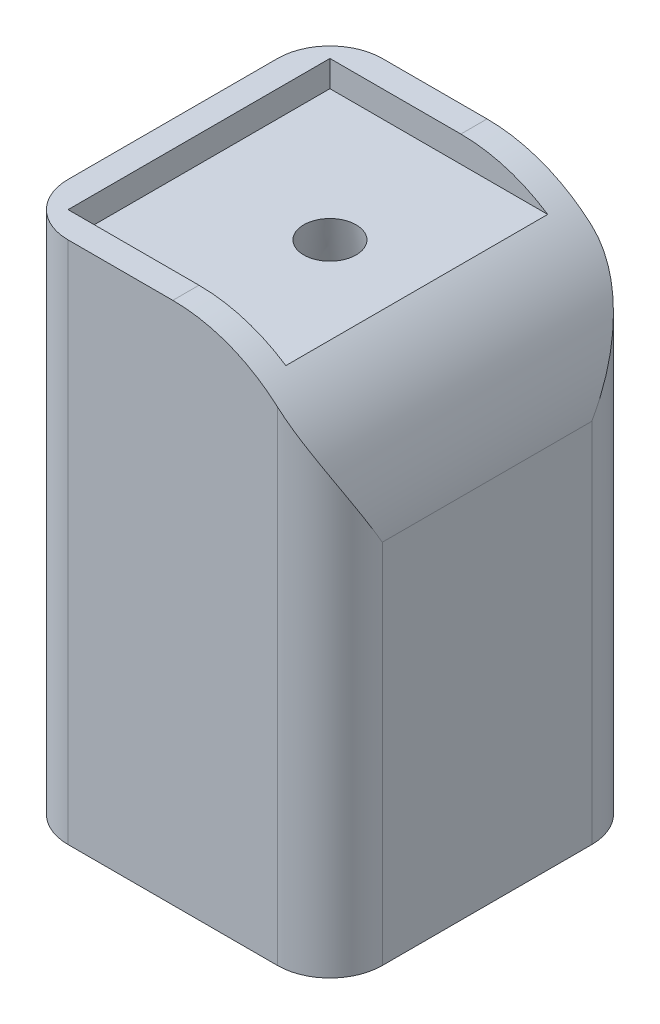
ISO-10303-21;
HEADER;
FILE_DESCRIPTION(('STEP AP214'),'2;1');
FILE_NAME('part.step','',(''),(''),'','','');
FILE_SCHEMA(('AUTOMOTIVE_DESIGN { 1 0 10303 214 1 1 1 1 }'));
ENDSEC;
DATA;
#1=APPLICATION_CONTEXT('core data for automotive mechanical design processes');
#2=APPLICATION_PROTOCOL_DEFINITION('international standard','automotive_design',2000,#1);
#3=PRODUCT_CONTEXT('',#1,'mechanical');
#4=PRODUCT('Part','Part','',(#3));
#5=PRODUCT_RELATED_PRODUCT_CATEGORY('part','',(#4));
#6=PRODUCT_DEFINITION_FORMATION('','',#4);
#7=PRODUCT_DEFINITION_CONTEXT('part definition',#1,'design');
#8=PRODUCT_DEFINITION('design','',#6,#7);
#9=PRODUCT_DEFINITION_SHAPE('','',#8);
#10=(LENGTH_UNIT() NAMED_UNIT(*) SI_UNIT(.MILLI.,.METRE.));
#11=(NAMED_UNIT(*) PLANE_ANGLE_UNIT() SI_UNIT($,.RADIAN.));
#12=(NAMED_UNIT(*) SI_UNIT($,.STERADIAN.) SOLID_ANGLE_UNIT());
#13=UNCERTAINTY_MEASURE_WITH_UNIT(LENGTH_MEASURE(1.E-05),#10,'distance_accuracy_value','');
#14=(GEOMETRIC_REPRESENTATION_CONTEXT(3) GLOBAL_UNCERTAINTY_ASSIGNED_CONTEXT((#13)) GLOBAL_UNIT_ASSIGNED_CONTEXT((#10,
#11,#12)) REPRESENTATION_CONTEXT('',''));
#15=CARTESIAN_POINT('',(0.,0.,0.));
#16=DIRECTION('',(0.,0.,1.));
#17=DIRECTION('',(1.,0.,0.));
#18=AXIS2_PLACEMENT_3D('',#15,#16,#17);
#19=CARTESIAN_POINT('',(0.,47.5,0.));
#20=DIRECTION('',(0.,-1.,0.));
#21=DIRECTION('',(0.,0.,-1.));
#22=AXIS2_PLACEMENT_3D('',#19,#20,#21);
#23=PLANE('',#22);
#24=CARTESIAN_POINT('',(0.,47.5,0.));
#25=DIRECTION('',(0.,1.,0.));
#26=DIRECTION('',(0.,0.,1.));
#27=AXIS2_PLACEMENT_3D('',#24,#25,#26);
#28=CIRCLE('',#27,2.5);
#29=CARTESIAN_POINT('',(0.784484004687969,47.5,-2.37372804811097));
#30=VERTEX_POINT('',#29);
#31=EDGE_CURVE('E258',#30,#30,#28,.T.);
#32=ORIENTED_EDGE('',*,*,#31,.F.);
#33=EDGE_LOOP('',(#32));
#34=FACE_BOUND('',#33,.T.);
#35=DIRECTION('',(0.,0.,1.));
#36=VECTOR('',#35,1.);
#37=CARTESIAN_POINT('',(8.2915619758885,47.5,-15.));
#38=LINE('',#37,#36);
#39=CARTESIAN_POINT('',(8.2915619758885,47.5,-12.5));
#40=VERTEX_POINT('',#39);
#41=CARTESIAN_POINT('',(8.2915619758885,47.5,12.5));
#42=VERTEX_POINT('',#41);
#43=EDGE_CURVE('E269',#40,#42,#38,.T.);
#44=ORIENTED_EDGE('',*,*,#43,.F.);
#45=DIRECTION('',(-1.,0.,0.));
#46=VECTOR('',#45,1.);
#47=CARTESIAN_POINT('',(-12.5,47.5,-12.5));
#48=LINE('',#47,#46);
#49=CARTESIAN_POINT('',(-12.5,47.5,-12.5));
#50=VERTEX_POINT('',#49);
#51=EDGE_CURVE('E241',#40,#50,#48,.T.);
#52=ORIENTED_EDGE('',*,*,#51,.T.);
#53=DIRECTION('',(0.,0.,1.));
#54=VECTOR('',#53,1.);
#55=CARTESIAN_POINT('',(-12.5,47.5,12.5));
#56=LINE('',#55,#54);
#57=CARTESIAN_POINT('',(-12.5,47.5,12.5));
#58=VERTEX_POINT('',#57);
#59=EDGE_CURVE('E244',#50,#58,#56,.T.);
#60=ORIENTED_EDGE('',*,*,#59,.T.);
#61=DIRECTION('',(1.,0.,0.));
#62=VECTOR('',#61,1.);
#63=CARTESIAN_POINT('',(-12.5,47.5,12.5));
#64=LINE('',#63,#62);
#65=EDGE_CURVE('E249',#58,#42,#64,.T.);
#66=ORIENTED_EDGE('',*,*,#65,.T.);
#67=EDGE_LOOP('',(#44,#52,#60,#66));
#68=FACE_BOUND('',#67,.T.);
#69=ADVANCED_FACE('F41',(#34,#68),#23,.F.);
#70=CARTESIAN_POINT('',(-15.,50.,-15.));
#71=DIRECTION('',(0.,0.,1.));
#72=DIRECTION('',(1.,0.,0.));
#73=AXIS2_PLACEMENT_3D('',#70,#71,#72);
#74=PLANE('',#73);
#75=CARTESIAN_POINT('',(0.,35.,-15.));
#76=DIRECTION('',(0.,0.,1.));
#77=DIRECTION('',(1.,0.,0.));
#78=AXIS2_PLACEMENT_3D('',#75,#76,#77);
#79=CIRCLE('',#78,15.);
#80=CARTESIAN_POINT('',(10.,46.180339887499,-15.));
#81=VERTEX_POINT('',#80);
#82=CARTESIAN_POINT('',(0.,50.,-15.));
#83=VERTEX_POINT('',#82);
#84=EDGE_CURVE('E141',#81,#83,#79,.T.);
#85=ORIENTED_EDGE('',*,*,#84,.F.);
#86=DIRECTION('',(0.,-1.,0.));
#87=VECTOR('',#86,1.);
#88=CARTESIAN_POINT('',(10.,50.,-15.));
#89=LINE('',#88,#87);
#90=CARTESIAN_POINT('',(10.,0.,-15.));
#91=VERTEX_POINT('',#90);
#92=EDGE_CURVE('E188',#81,#91,#89,.T.);
#93=ORIENTED_EDGE('',*,*,#92,.T.);
#94=DIRECTION('',(-1.,0.,0.));
#95=VECTOR('',#94,1.);
#96=CARTESIAN_POINT('',(-15.,0.,-15.));
#97=LINE('',#96,#95);
#98=CARTESIAN_POINT('',(-10.,0.,-15.));
#99=VERTEX_POINT('',#98);
#100=EDGE_CURVE('E182',#91,#99,#97,.T.);
#101=ORIENTED_EDGE('',*,*,#100,.T.);
#102=DIRECTION('',(0.,-1.,0.));
#103=VECTOR('',#102,1.);
#104=CARTESIAN_POINT('',(-10.,50.,-15.));
#105=LINE('',#104,#103);
#106=CARTESIAN_POINT('',(-10.,50.,-15.));
#107=VERTEX_POINT('',#106);
#108=EDGE_CURVE('E164',#99,#107,#105,.F.);
#109=ORIENTED_EDGE('',*,*,#108,.T.);
#110=DIRECTION('',(-1.,0.,0.));
#111=VECTOR('',#110,1.);
#112=CARTESIAN_POINT('',(-15.,50.,-15.));
#113=LINE('',#112,#111);
#114=EDGE_CURVE('E155',#83,#107,#113,.T.);
#115=ORIENTED_EDGE('',*,*,#114,.F.);
#116=EDGE_LOOP('',(#85,#93,#101,#109,#115));
#117=FACE_BOUND('',#116,.T.);
#118=ADVANCED_FACE('F161',(#117),#74,.F.);
#119=CARTESIAN_POINT('',(-15.,50.,15.));
#120=DIRECTION('',(0.,0.,-1.));
#121=DIRECTION('',(-1.,0.,0.));
#122=AXIS2_PLACEMENT_3D('',#119,#120,#121);
#123=PLANE('',#122);
#124=CARTESIAN_POINT('',(0.,35.,15.));
#125=DIRECTION('',(0.,0.,1.));
#126=DIRECTION('',(1.,0.,0.));
#127=AXIS2_PLACEMENT_3D('',#124,#125,#126);
#128=CIRCLE('',#127,15.);
#129=CARTESIAN_POINT('',(10.,46.180339887499,15.));
#130=VERTEX_POINT('',#129);
#131=CARTESIAN_POINT('',(0.,50.,15.));
#132=VERTEX_POINT('',#131);
#133=EDGE_CURVE('E62',#130,#132,#128,.T.);
#134=ORIENTED_EDGE('',*,*,#133,.T.);
#135=DIRECTION('',(1.,0.,0.));
#136=VECTOR('',#135,1.);
#137=CARTESIAN_POINT('',(-15.,50.,15.));
#138=LINE('',#137,#136);
#139=CARTESIAN_POINT('',(-10.,50.,15.));
#140=VERTEX_POINT('',#139);
#141=EDGE_CURVE('E169',#140,#132,#138,.T.);
#142=ORIENTED_EDGE('',*,*,#141,.F.);
#143=DIRECTION('',(0.,-1.,0.));
#144=VECTOR('',#143,1.);
#145=CARTESIAN_POINT('',(-10.,50.,15.));
#146=LINE('',#145,#144);
#147=CARTESIAN_POINT('',(-10.,0.,15.));
#148=VERTEX_POINT('',#147);
#149=EDGE_CURVE('E206',#140,#148,#146,.T.);
#150=ORIENTED_EDGE('',*,*,#149,.T.);
#151=DIRECTION('',(1.,0.,0.));
#152=VECTOR('',#151,1.);
#153=CARTESIAN_POINT('',(-15.,0.,15.));
#154=LINE('',#153,#152);
#155=CARTESIAN_POINT('',(10.,0.,15.));
#156=VERTEX_POINT('',#155);
#157=EDGE_CURVE('E167',#148,#156,#154,.T.);
#158=ORIENTED_EDGE('',*,*,#157,.T.);
#159=DIRECTION('',(0.,-1.,0.));
#160=VECTOR('',#159,1.);
#161=CARTESIAN_POINT('',(10.,50.,15.));
#162=LINE('',#161,#160);
#163=EDGE_CURVE('E209',#156,#130,#162,.F.);
#164=ORIENTED_EDGE('',*,*,#163,.T.);
#165=EDGE_LOOP('',(#134,#142,#150,#158,#164));
#166=FACE_BOUND('',#165,.T.);
#167=ADVANCED_FACE('F228',(#166),#123,.F.);
#168=CARTESIAN_POINT('',(0.,50.,0.));
#169=DIRECTION('',(0.,-1.,0.));
#170=DIRECTION('',(0.,0.,-1.));
#171=AXIS2_PLACEMENT_3D('',#168,#169,#170);
#172=PLANE('',#171);
#173=DIRECTION('',(0.,0.,1.));
#174=VECTOR('',#173,1.);
#175=CARTESIAN_POINT('',(0.,50.,-15.));
#176=LINE('',#175,#174);
#177=CARTESIAN_POINT('',(0.,50.,-12.5));
#178=VERTEX_POINT('',#177);
#179=EDGE_CURVE('E144',#83,#178,#176,.T.);
#180=ORIENTED_EDGE('',*,*,#179,.F.);
#181=ORIENTED_EDGE('',*,*,#114,.T.);
#182=CARTESIAN_POINT('',(-10.,50.,-10.));
#183=DIRECTION('',(0.,-1.,0.));
#184=DIRECTION('',(0.,0.,-1.));
#185=AXIS2_PLACEMENT_3D('',#182,#183,#184);
#186=CIRCLE('',#185,5.);
#187=CARTESIAN_POINT('',(-15.,50.,-10.));
#188=VERTEX_POINT('',#187);
#189=EDGE_CURVE('E204',#107,#188,#186,.F.);
#190=ORIENTED_EDGE('',*,*,#189,.T.);
#191=DIRECTION('',(0.,0.,1.));
#192=VECTOR('',#191,1.);
#193=CARTESIAN_POINT('',(-15.,50.,15.));
#194=LINE('',#193,#192);
#195=CARTESIAN_POINT('',(-15.,50.,10.));
#196=VERTEX_POINT('',#195);
#197=EDGE_CURVE('E166',#188,#196,#194,.T.);
#198=ORIENTED_EDGE('',*,*,#197,.T.);
#199=CARTESIAN_POINT('',(-10.,50.,10.));
#200=DIRECTION('',(0.,-1.,0.));
#201=DIRECTION('',(0.,0.,-1.));
#202=AXIS2_PLACEMENT_3D('',#199,#200,#201);
#203=CIRCLE('',#202,5.);
#204=EDGE_CURVE('E69',#196,#140,#203,.F.);
#205=ORIENTED_EDGE('',*,*,#204,.T.);
#206=ORIENTED_EDGE('',*,*,#141,.T.);
#207=CARTESIAN_POINT('',(0.,50.,12.5));
#208=VERTEX_POINT('',#207);
#209=EDGE_CURVE('E159',#208,#132,#176,.T.);
#210=ORIENTED_EDGE('',*,*,#209,.F.);
#211=DIRECTION('',(1.,0.,0.));
#212=VECTOR('',#211,1.);
#213=CARTESIAN_POINT('',(-12.5,50.,12.5));
#214=LINE('',#213,#212);
#215=CARTESIAN_POINT('',(-12.5,50.,12.5));
#216=VERTEX_POINT('',#215);
#217=EDGE_CURVE('E233',#216,#208,#214,.T.);
#218=ORIENTED_EDGE('',*,*,#217,.F.);
#219=DIRECTION('',(0.,0.,1.));
#220=VECTOR('',#219,1.);
#221=CARTESIAN_POINT('',(-12.5,50.,12.5));
#222=LINE('',#221,#220);
#223=CARTESIAN_POINT('',(-12.5,50.,-12.5));
#224=VERTEX_POINT('',#223);
#225=EDGE_CURVE('E242',#224,#216,#222,.T.);
#226=ORIENTED_EDGE('',*,*,#225,.F.);
#227=DIRECTION('',(-1.,0.,0.));
#228=VECTOR('',#227,1.);
#229=CARTESIAN_POINT('',(-12.5,50.,-12.5));
#230=LINE('',#229,#228);
#231=EDGE_CURVE('E158',#178,#224,#230,.T.);
#232=ORIENTED_EDGE('',*,*,#231,.F.);
#233=EDGE_LOOP('',(#180,#181,#190,#198,#205,#206,#210,#218,#226,#232));
#234=FACE_BOUND('',#233,.T.);
#235=ADVANCED_FACE('F154',(#234),#172,.F.);
#236=CARTESIAN_POINT('',(-12.5,47.5,12.5));
#237=DIRECTION('',(0.,0.,1.));
#238=DIRECTION('',(1.,0.,0.));
#239=AXIS2_PLACEMENT_3D('',#236,#237,#238);
#240=PLANE('',#239);
#241=CARTESIAN_POINT('',(0.,35.,12.5));
#242=DIRECTION('',(0.,0.,1.));
#243=DIRECTION('',(1.,0.,0.));
#244=AXIS2_PLACEMENT_3D('',#241,#242,#243);
#245=CIRCLE('',#244,15.);
#246=EDGE_CURVE('E238',#42,#208,#245,.T.);
#247=ORIENTED_EDGE('',*,*,#246,.F.);
#248=ORIENTED_EDGE('',*,*,#65,.F.);
#249=DIRECTION('',(0.,1.,0.));
#250=VECTOR('',#249,1.);
#251=CARTESIAN_POINT('',(-12.5,47.5,12.5));
#252=LINE('',#251,#250);
#253=EDGE_CURVE('E183',#58,#216,#252,.T.);
#254=ORIENTED_EDGE('',*,*,#253,.T.);
#255=ORIENTED_EDGE('',*,*,#217,.T.);
#256=EDGE_LOOP('',(#247,#248,#254,#255));
#257=FACE_BOUND('',#256,.T.);
#258=ADVANCED_FACE('F236',(#257),#240,.F.);
#259=CARTESIAN_POINT('',(-12.5,47.5,-12.5));
#260=DIRECTION('',(0.,0.,-1.));
#261=DIRECTION('',(-1.,0.,0.));
#262=AXIS2_PLACEMENT_3D('',#259,#260,#261);
#263=PLANE('',#262);
#264=CARTESIAN_POINT('',(0.,35.,-12.5));
#265=DIRECTION('',(0.,0.,-1.));
#266=DIRECTION('',(-1.,0.,0.));
#267=AXIS2_PLACEMENT_3D('',#264,#265,#266);
#268=CIRCLE('',#267,15.);
#269=EDGE_CURVE('E271',#178,#40,#268,.T.);
#270=ORIENTED_EDGE('',*,*,#269,.F.);
#271=ORIENTED_EDGE('',*,*,#231,.T.);
#272=DIRECTION('',(0.,1.,0.));
#273=VECTOR('',#272,1.);
#274=CARTESIAN_POINT('',(-12.5,47.5,-12.5));
#275=LINE('',#274,#273);
#276=EDGE_CURVE('E175',#50,#224,#275,.T.);
#277=ORIENTED_EDGE('',*,*,#276,.F.);
#278=ORIENTED_EDGE('',*,*,#51,.F.);
#279=EDGE_LOOP('',(#270,#271,#277,#278));
#280=FACE_BOUND('',#279,.T.);
#281=ADVANCED_FACE('F302',(#280),#263,.F.);
#282=CARTESIAN_POINT('',(10.,50.,-10.));
#283=DIRECTION('',(0.,-1.,0.));
#284=DIRECTION('',(0.,0.,-1.));
#285=AXIS2_PLACEMENT_3D('',#282,#283,#284);
#286=CYLINDRICAL_SURFACE('',#285,5.);
#287=ORIENTED_EDGE('',*,*,#92,.F.);
#288=CARTESIAN_POINT('',(10.,46.180339887499,-15.));
#289=CARTESIAN_POINT('',(10.1582763405276,46.0388041106882,-14.9999789471914));
#290=CARTESIAN_POINT('',(10.3134305586914,45.8939518605418,-14.9924877185867));
#291=CARTESIAN_POINT('',(10.6166669460226,45.5986286963393,-14.964164257364));
#292=CARTESIAN_POINT('',(10.7647578536189,45.4481651580511,-14.9433489942583));
#293=CARTESIAN_POINT('',(11.0523923075283,45.1433855437632,-14.8901634266235));
#294=CARTESIAN_POINT('',(11.1919903301496,44.9891055832873,-14.857878531768));
#295=CARTESIAN_POINT('',(11.4635444779948,44.676263535327,-14.7830827735591));
#296=CARTESIAN_POINT('',(11.5954968664689,44.5176994085809,-14.740566961361));
#297=CARTESIAN_POINT('',(11.9356674845462,44.0915039051407,-14.6156570882601));
#298=CARTESIAN_POINT('',(12.1370312299635,43.8206635070832,-14.5254155884419));
#299=CARTESIAN_POINT('',(12.5179833090766,43.2711549502651,-14.3250555664934));
#300=CARTESIAN_POINT('',(12.6975625672782,42.9924835882369,-14.2149288073142));
#301=CARTESIAN_POINT('',(13.0362059547031,42.4274113875824,-13.9779888564919));
#302=CARTESIAN_POINT('',(13.1951459463449,42.1409752703307,-13.8510831962537));
#303=CARTESIAN_POINT('',(13.4917952267149,41.5633003699634,-13.5842929037347));
#304=CARTESIAN_POINT('',(13.6295050868715,41.2720617163461,-13.4444086209477));
#305=CARTESIAN_POINT('',(13.938297072924,40.5615609557125,-13.092798697351));
#306=CARTESIAN_POINT('',(14.0988094408246,40.1403214076497,-12.8757392329876));
#307=CARTESIAN_POINT('',(14.3796798951958,39.2923688370812,-12.4266393478454));
#308=CARTESIAN_POINT('',(14.500017789681,38.8656531737862,-12.1945914634918));
#309=CARTESIAN_POINT('',(14.7015067261381,38.0097353389784,-11.7210115595236));
#310=CARTESIAN_POINT('',(14.7827530021897,37.5805418146787,-11.4795041547694));
#311=CARTESIAN_POINT('',(14.9073606339177,36.7202897700568,-10.990657325318));
#312=CARTESIAN_POINT('',(14.9507412523227,36.2892323102348,-10.7433209317458));
#313=CARTESIAN_POINT('',(14.9914191507309,35.5790406398849,-10.3342989313816));
#314=CARTESIAN_POINT('',(14.999590616265,35.3001138078265,-10.1732705322517));
#315=CARTESIAN_POINT('',(14.9999949989684,35.0141421195807,-10.0081649567448));
#316=CARTESIAN_POINT('',(14.9999999988682,35.0070710499347,-10.0040824727827));
#317=CARTESIAN_POINT('',(15.,35.,-10.));
#318=B_SPLINE_CURVE_WITH_KNOTS('',3,(#288,#289,#290,#291,#292,#293,#294,#295,#296,#297,#298,
#299,#300,#301,#302,#303,#304,#305,#306,#307,#308,#309,#310,#311,#312,#313,#314,#315,#316,#317),
.UNSPECIFIED.,.F.,.F.,(4,2,2,2,2,2,2,2,2,2,2,2,2,2,4),(0.,0.636640224091678,1.27247123106091,
1.90366342618657,2.53516155413694,3.58158012411535,4.62843314943573,5.68131662435383,
6.73417175500271,8.23296589524534,9.7325122103013,11.2283866330836,12.7234996417953,
13.689637293568,13.7141321955886),.UNSPECIFIED.);
#319=CARTESIAN_POINT('',(15.,35.,-10.));
#320=VERTEX_POINT('',#319);
#321=EDGE_CURVE('E147',#81,#320,#318,.T.);
#322=ORIENTED_EDGE('',*,*,#321,.T.);
#323=DIRECTION('',(0.,-1.,0.));
#324=VECTOR('',#323,1.);
#325=CARTESIAN_POINT('',(15.,50.,-10.));
#326=LINE('',#325,#324);
#327=CARTESIAN_POINT('',(15.,0.,-10.));
#328=VERTEX_POINT('',#327);
#329=EDGE_CURVE('E200',#328,#320,#326,.F.);
#330=ORIENTED_EDGE('',*,*,#329,.F.);
#331=CARTESIAN_POINT('',(10.,0.,-10.));
#332=DIRECTION('',(0.,-1.,0.));
#333=DIRECTION('',(0.,0.,-1.));
#334=AXIS2_PLACEMENT_3D('',#331,#332,#333);
#335=CIRCLE('',#334,5.);
#336=EDGE_CURVE('E196',#91,#328,#335,.T.);
#337=ORIENTED_EDGE('',*,*,#336,.F.);
#338=EDGE_LOOP('',(#287,#322,#330,#337));
#339=FACE_BOUND('',#338,.T.);
#340=ADVANCED_FACE('F279',(#339),#286,.T.);
#341=CARTESIAN_POINT('',(10.,50.,10.));
#342=DIRECTION('',(0.,-1.,0.));
#343=DIRECTION('',(0.,0.,-1.));
#344=AXIS2_PLACEMENT_3D('',#341,#342,#343);
#345=CYLINDRICAL_SURFACE('',#344,5.);
#346=DIRECTION('',(0.,-1.,0.));
#347=VECTOR('',#346,1.);
#348=CARTESIAN_POINT('',(15.,50.,10.));
#349=LINE('',#348,#347);
#350=CARTESIAN_POINT('',(15.,35.,10.));
#351=VERTEX_POINT('',#350);
#352=CARTESIAN_POINT('',(15.,0.,10.));
#353=VERTEX_POINT('',#352);
#354=EDGE_CURVE('E198',#351,#353,#349,.T.);
#355=ORIENTED_EDGE('',*,*,#354,.F.);
#356=CARTESIAN_POINT('',(10.,46.180339887499,15.));
#357=CARTESIAN_POINT('',(10.1582763405276,46.0388041106882,14.9999789471914));
#358=CARTESIAN_POINT('',(10.3134305586914,45.8939518605418,14.9924877185867));
#359=CARTESIAN_POINT('',(10.6166669460226,45.5986286963393,14.964164257364));
#360=CARTESIAN_POINT('',(10.7647578536189,45.4481651580511,14.9433489942583));
#361=CARTESIAN_POINT('',(11.0523923075283,45.1433855437632,14.8901634266235));
#362=CARTESIAN_POINT('',(11.1919903301496,44.9891055832873,14.857878531768));
#363=CARTESIAN_POINT('',(11.4635444779948,44.676263535327,14.7830827735591));
#364=CARTESIAN_POINT('',(11.5954968664689,44.5176994085809,14.740566961361));
#365=CARTESIAN_POINT('',(11.9356674845462,44.0915039051407,14.6156570882601));
#366=CARTESIAN_POINT('',(12.1370312299635,43.8206635070832,14.5254155884419));
#367=CARTESIAN_POINT('',(12.5179833090766,43.2711549502651,14.3250555664934));
#368=CARTESIAN_POINT('',(12.6975625672782,42.9924835882369,14.2149288073142));
#369=CARTESIAN_POINT('',(13.0362059547031,42.4274113875824,13.9779888564919));
#370=CARTESIAN_POINT('',(13.1951459463449,42.1409752703307,13.8510831962537));
#371=CARTESIAN_POINT('',(13.4917952267149,41.5633003699634,13.5842929037347));
#372=CARTESIAN_POINT('',(13.6295050868715,41.2720617163461,13.4444086209477));
#373=CARTESIAN_POINT('',(13.938297072924,40.5615609557125,13.092798697351));
#374=CARTESIAN_POINT('',(14.0988094408246,40.1403214076497,12.8757392329876));
#375=CARTESIAN_POINT('',(14.3796798951958,39.2923688370812,12.4266393478454));
#376=CARTESIAN_POINT('',(14.500017789681,38.8656531737862,12.1945914634918));
#377=CARTESIAN_POINT('',(14.7015067261381,38.0097353389784,11.7210115595236));
#378=CARTESIAN_POINT('',(14.7827530021897,37.5805418146787,11.4795041547694));
#379=CARTESIAN_POINT('',(14.9073606339177,36.7202897700568,10.990657325318));
#380=CARTESIAN_POINT('',(14.9507412523227,36.2892323102348,10.7433209317458));
#381=CARTESIAN_POINT('',(14.9914191507309,35.5790406398849,10.3342989313816));
#382=CARTESIAN_POINT('',(14.999590616265,35.3001138078265,10.1732705322517));
#383=CARTESIAN_POINT('',(14.9999949989684,35.0141421195807,10.0081649567448));
#384=CARTESIAN_POINT('',(14.9999999988682,35.0070710499347,10.0040824727827));
#385=CARTESIAN_POINT('',(15.,35.,10.));
#386=B_SPLINE_CURVE_WITH_KNOTS('',3,(#356,#357,#358,#359,#360,#361,#362,#363,#364,#365,#366,
#367,#368,#369,#370,#371,#372,#373,#374,#375,#376,#377,#378,#379,#380,#381,#382,#383,#384,#385),
.UNSPECIFIED.,.F.,.F.,(4,2,2,2,2,2,2,2,2,2,2,2,2,2,4),(0.,0.636640224091678,1.27247123106091,
1.90366342618657,2.53516155413694,3.58158012411535,4.62843314943573,5.68131662435383,
6.73417175500271,8.23296589524534,9.7325122103013,11.2283866330836,12.7234996417953,
13.689637293568,13.7141321955886),.UNSPECIFIED.);
#387=EDGE_CURVE('E12',#351,#130,#386,.F.);
#388=ORIENTED_EDGE('',*,*,#387,.T.);
#389=ORIENTED_EDGE('',*,*,#163,.F.);
#390=CARTESIAN_POINT('',(10.,0.,10.));
#391=DIRECTION('',(0.,-1.,0.));
#392=DIRECTION('',(0.,0.,-1.));
#393=AXIS2_PLACEMENT_3D('',#390,#391,#392);
#394=CIRCLE('',#393,5.);
#395=EDGE_CURVE('E194',#353,#156,#394,.T.);
#396=ORIENTED_EDGE('',*,*,#395,.F.);
#397=EDGE_LOOP('',(#355,#388,#389,#396));
#398=FACE_BOUND('',#397,.T.);
#399=ADVANCED_FACE('F321',(#398),#345,.T.);
#400=CARTESIAN_POINT('',(15.,50.,15.));
#401=DIRECTION('',(-1.,0.,0.));
#402=DIRECTION('',(0.,0.,1.));
#403=AXIS2_PLACEMENT_3D('',#400,#401,#402);
#404=PLANE('',#403);
#405=ORIENTED_EDGE('',*,*,#329,.T.);
#406=DIRECTION('',(0.,0.,1.));
#407=VECTOR('',#406,1.);
#408=CARTESIAN_POINT('',(15.,35.,-15.));
#409=LINE('',#408,#407);
#410=EDGE_CURVE('E151',#320,#351,#409,.T.);
#411=ORIENTED_EDGE('',*,*,#410,.T.);
#412=ORIENTED_EDGE('',*,*,#354,.T.);
#413=DIRECTION('',(0.,0.,-1.));
#414=VECTOR('',#413,1.);
#415=CARTESIAN_POINT('',(15.,0.,15.));
#416=LINE('',#415,#414);
#417=EDGE_CURVE('E179',#353,#328,#416,.T.);
#418=ORIENTED_EDGE('',*,*,#417,.T.);
#419=EDGE_LOOP('',(#405,#411,#412,#418));
#420=FACE_BOUND('',#419,.T.);
#421=ADVANCED_FACE('F318',(#420),#404,.F.);
#422=CARTESIAN_POINT('',(-15.,50.,15.));
#423=DIRECTION('',(1.,0.,0.));
#424=DIRECTION('',(0.,0.,-1.));
#425=AXIS2_PLACEMENT_3D('',#422,#423,#424);
#426=PLANE('',#425);
#427=ORIENTED_EDGE('',*,*,#197,.F.);
#428=DIRECTION('',(0.,-1.,0.));
#429=VECTOR('',#428,1.);
#430=CARTESIAN_POINT('',(-15.,50.,-10.));
#431=LINE('',#430,#429);
#432=CARTESIAN_POINT('',(-15.,0.,-10.));
#433=VERTEX_POINT('',#432);
#434=EDGE_CURVE('E55',#188,#433,#431,.T.);
#435=ORIENTED_EDGE('',*,*,#434,.T.);
#436=DIRECTION('',(0.,0.,1.));
#437=VECTOR('',#436,1.);
#438=CARTESIAN_POINT('',(-15.,0.,15.));
#439=LINE('',#438,#437);
#440=CARTESIAN_POINT('',(-15.,0.,10.));
#441=VERTEX_POINT('',#440);
#442=EDGE_CURVE('E172',#433,#441,#439,.T.);
#443=ORIENTED_EDGE('',*,*,#442,.T.);
#444=DIRECTION('',(0.,-1.,0.));
#445=VECTOR('',#444,1.);
#446=CARTESIAN_POINT('',(-15.,50.,10.));
#447=LINE('',#446,#445);
#448=EDGE_CURVE('E212',#441,#196,#447,.F.);
#449=ORIENTED_EDGE('',*,*,#448,.T.);
#450=EDGE_LOOP('',(#427,#435,#443,#449));
#451=FACE_BOUND('',#450,.T.);
#452=ADVANCED_FACE('F218',(#451),#426,.F.);
#453=CARTESIAN_POINT('',(0.,0.,0.));
#454=DIRECTION('',(0.,-1.,0.));
#455=DIRECTION('',(0.,0.,-1.));
#456=AXIS2_PLACEMENT_3D('',#453,#454,#455);
#457=PLANE('',#456);
#458=CARTESIAN_POINT('',(0.,0.,0.));
#459=DIRECTION('',(0.,-1.,0.));
#460=DIRECTION('',(0.,0.,-1.));
#461=AXIS2_PLACEMENT_3D('',#458,#459,#460);
#462=CIRCLE('',#461,12.5);
#463=CARTESIAN_POINT('',(0.,0.,-12.5));
#464=VERTEX_POINT('',#463);
#465=EDGE_CURVE('E261',#464,#464,#462,.T.);
#466=ORIENTED_EDGE('',*,*,#465,.F.);
#467=EDGE_LOOP('',(#466));
#468=FACE_BOUND('',#467,.T.);
#469=ORIENTED_EDGE('',*,*,#100,.F.);
#470=ORIENTED_EDGE('',*,*,#336,.T.);
#471=ORIENTED_EDGE('',*,*,#417,.F.);
#472=ORIENTED_EDGE('',*,*,#395,.T.);
#473=ORIENTED_EDGE('',*,*,#157,.F.);
#474=CARTESIAN_POINT('',(-10.,0.,10.));
#475=DIRECTION('',(0.,-1.,0.));
#476=DIRECTION('',(0.,0.,-1.));
#477=AXIS2_PLACEMENT_3D('',#474,#475,#476);
#478=CIRCLE('',#477,5.);
#479=EDGE_CURVE('E190',#148,#441,#478,.T.);
#480=ORIENTED_EDGE('',*,*,#479,.T.);
#481=ORIENTED_EDGE('',*,*,#442,.F.);
#482=CARTESIAN_POINT('',(-10.,0.,-10.));
#483=DIRECTION('',(0.,-1.,0.));
#484=DIRECTION('',(0.,0.,-1.));
#485=AXIS2_PLACEMENT_3D('',#482,#483,#484);
#486=CIRCLE('',#485,5.);
#487=EDGE_CURVE('E192',#433,#99,#486,.T.);
#488=ORIENTED_EDGE('',*,*,#487,.T.);
#489=EDGE_LOOP('',(#469,#470,#471,#472,#473,#480,#481,#488));
#490=FACE_BOUND('',#489,.T.);
#491=ADVANCED_FACE('F223',(#468,#490),#457,.T.);
#492=CARTESIAN_POINT('',(-12.5,47.5,12.5));
#493=DIRECTION('',(-1.,0.,0.));
#494=DIRECTION('',(0.,0.,1.));
#495=AXIS2_PLACEMENT_3D('',#492,#493,#494);
#496=PLANE('',#495);
#497=ORIENTED_EDGE('',*,*,#225,.T.);
#498=ORIENTED_EDGE('',*,*,#253,.F.);
#499=ORIENTED_EDGE('',*,*,#59,.F.);
#500=ORIENTED_EDGE('',*,*,#276,.T.);
#501=EDGE_LOOP('',(#497,#498,#499,#500));
#502=FACE_BOUND('',#501,.T.);
#503=ADVANCED_FACE('F303',(#502),#496,.F.);
#504=CARTESIAN_POINT('',(-10.,50.,-10.));
#505=DIRECTION('',(0.,-1.,0.));
#506=DIRECTION('',(0.,0.,-1.));
#507=AXIS2_PLACEMENT_3D('',#504,#505,#506);
#508=CYLINDRICAL_SURFACE('',#507,5.);
#509=ORIENTED_EDGE('',*,*,#189,.F.);
#510=ORIENTED_EDGE('',*,*,#108,.F.);
#511=ORIENTED_EDGE('',*,*,#487,.F.);
#512=ORIENTED_EDGE('',*,*,#434,.F.);
#513=EDGE_LOOP('',(#509,#510,#511,#512));
#514=FACE_BOUND('',#513,.T.);
#515=ADVANCED_FACE('F306',(#514),#508,.T.);
#516=CARTESIAN_POINT('',(-10.,50.,10.));
#517=DIRECTION('',(0.,-1.,0.));
#518=DIRECTION('',(0.,0.,-1.));
#519=AXIS2_PLACEMENT_3D('',#516,#517,#518);
#520=CYLINDRICAL_SURFACE('',#519,5.);
#521=ORIENTED_EDGE('',*,*,#204,.F.);
#522=ORIENTED_EDGE('',*,*,#448,.F.);
#523=ORIENTED_EDGE('',*,*,#479,.F.);
#524=ORIENTED_EDGE('',*,*,#149,.F.);
#525=EDGE_LOOP('',(#521,#522,#523,#524));
#526=FACE_BOUND('',#525,.T.);
#527=ADVANCED_FACE('F43',(#526),#520,.T.);
#528=CARTESIAN_POINT('',(0.,0.,-12.5));
#529=CARTESIAN_POINT('',(0.784484004687969,47.5,-2.37372804811097));
#530=CARTESIAN_POINT('',(-25.,0.,-12.5));
#531=CARTESIAN_POINT('',(-3.96297209153398,47.5,-3.94269605748691));
#532=CARTESIAN_POINT('',(-25.,0.,12.5));
#533=CARTESIAN_POINT('',(-5.53194010090991,47.5,0.804760038735037));
#534=CARTESIAN_POINT('',(0.,0.,12.5));
#535=CARTESIAN_POINT('',(-0.784484004687968,47.5,2.37372804811097));
#536=CARTESIAN_POINT('',(25.,0.,12.5));
#537=CARTESIAN_POINT('',(3.96297209153398,47.5,3.94269605748691));
#538=CARTESIAN_POINT('',(25.,0.,-12.5));
#539=CARTESIAN_POINT('',(5.53194010090991,47.5,-0.804760038735038));
#540=CARTESIAN_POINT('',(0.,0.,-12.5));
#541=CARTESIAN_POINT('',(0.784484004687969,47.5,-2.37372804811097));
#542=(BOUNDED_SURFACE() B_SPLINE_SURFACE(3,1,((#528,#529),(#530,#531),(#532,#533),(#534,#535),
(#536,#537),(#538,#539),(#540,#541)),.UNSPECIFIED.,.T.,.F.,.F.) B_SPLINE_SURFACE_WITH_KNOTS((4,
3,4),(2,2),(0.,0.5,1.),(0.,1.),
.UNSPECIFIED.) GEOMETRIC_REPRESENTATION_ITEM() RATIONAL_B_SPLINE_SURFACE(((1.,1.),
(0.333333333333333,0.333333333333333),(0.333333333333333,0.333333333333333),(1.,1.),
(0.333333333333333,0.333333333333333),(0.333333333333333,0.333333333333333),(1.,1.))) REPRESENTATION_ITEM('') SURFACE());
#543=CARTESIAN_POINT('',(0.,0.,-12.5));
#544=CARTESIAN_POINT('',(0.00817170838216634,0.494791666666667,-12.3945180005012));
#545=CARTESIAN_POINT('',(0.0163434167643327,0.989583333333334,-12.2890360010023));
#546=CARTESIAN_POINT('',(0.0326868335286654,1.97916666666667,-12.0780720020046));
#547=CARTESIAN_POINT('',(0.0408585419108317,2.47395833333333,-11.9725900025058));
#548=CARTESIAN_POINT('',(0.0572019586751644,3.46354166666667,-11.7616260035081));
#549=CARTESIAN_POINT('',(0.0653736670573307,3.95833333333333,-11.6561440040092));
#550=CARTESIAN_POINT('',(0.0817170838216634,4.94791666666667,-11.4451800050116));
#551=CARTESIAN_POINT('',(0.0898887922038297,5.44270833333333,-11.3396980055127));
#552=CARTESIAN_POINT('',(0.106232208968162,6.43229166666667,-11.128734006515));
#553=CARTESIAN_POINT('',(0.114403917350329,6.92708333333333,-11.0232520070162));
#554=CARTESIAN_POINT('',(0.130747334114661,7.91666666666667,-10.8122880080185));
#555=CARTESIAN_POINT('',(0.138919042496828,8.41145833333333,-10.7068060085197));
#556=CARTESIAN_POINT('',(0.15526245926116,9.40104166666667,-10.495842009522));
#557=CARTESIAN_POINT('',(0.163434167643327,9.89583333333333,-10.3903600100231));
#558=CARTESIAN_POINT('',(0.179777584407659,10.8854166666667,-10.1793960110254));
#559=CARTESIAN_POINT('',(0.187949292789826,11.3802083333333,-10.0739140115266));
#560=CARTESIAN_POINT('',(0.204292709554158,12.3697916666667,-9.8629500125289));
#561=CARTESIAN_POINT('',(0.212464417936325,12.8645833333333,-9.75746801303006));
#562=CARTESIAN_POINT('',(0.228807834700657,13.8541666666667,-9.54650401403237));
#563=CARTESIAN_POINT('',(0.236979543082824,14.3489583333333,-9.44102201453352));
#564=CARTESIAN_POINT('',(0.253322959847157,15.3385416666667,-9.23005801553584));
#565=CARTESIAN_POINT('',(0.261494668229323,15.8333333333333,-9.12457601603699));
#566=CARTESIAN_POINT('',(0.277838084993656,16.8229166666667,-8.9136120170393));
#567=CARTESIAN_POINT('',(0.286009793375822,17.3177083333333,-8.80813001754046));
#568=CARTESIAN_POINT('',(0.302353210140155,18.3072916666667,-8.59716601854277));
#569=CARTESIAN_POINT('',(0.310524918522321,18.8020833333333,-8.49168401904393));
#570=CARTESIAN_POINT('',(0.326868335286654,19.7916666666667,-8.28072002004624));
#571=CARTESIAN_POINT('',(0.33504004366882,20.2864583333333,-8.1752380205474));
#572=CARTESIAN_POINT('',(0.351383460433152,21.2760416666667,-7.96427402154971));
#573=CARTESIAN_POINT('',(0.359555168815319,21.7708333333333,-7.85879202205086));
#574=CARTESIAN_POINT('',(0.375898585579652,22.7604166666667,-7.64782802305317));
#575=CARTESIAN_POINT('',(0.384070293961818,23.2552083333333,-7.54234602355433));
#576=CARTESIAN_POINT('',(0.400413710726151,24.2447916666667,-7.33138202455664));
#577=CARTESIAN_POINT('',(0.408585419108317,24.7395833333333,-7.2259000250578));
#578=CARTESIAN_POINT('',(0.42492883587265,25.7291666666667,-7.01493602606011));
#579=CARTESIAN_POINT('',(0.433100544254816,26.2239583333333,-6.90945402656127));
#580=CARTESIAN_POINT('',(0.449443961019149,27.2135416666667,-6.69849002756358));
#581=CARTESIAN_POINT('',(0.457615669401315,27.7083333333333,-6.59300802806473));
#582=CARTESIAN_POINT('',(0.473959086165648,28.6979166666667,-6.38204402906705));
#583=CARTESIAN_POINT('',(0.482130794547814,29.1927083333333,-6.2765620295682));
#584=CARTESIAN_POINT('',(0.498474211312147,30.1822916666667,-6.06559803057051));
#585=CARTESIAN_POINT('',(0.506645919694313,30.6770833333333,-5.96011603107167));
#586=CARTESIAN_POINT('',(0.522989336458646,31.6666666666667,-5.74915203207398));
#587=CARTESIAN_POINT('',(0.531161044840812,32.1614583333333,-5.64367003257514));
#588=CARTESIAN_POINT('',(0.547504461605145,33.1510416666667,-5.43270603357745));
#589=CARTESIAN_POINT('',(0.555676169987311,33.6458333333333,-5.32722403407861));
#590=CARTESIAN_POINT('',(0.572019586751644,34.6354166666667,-5.11626003508092));
#591=CARTESIAN_POINT('',(0.58019129513381,35.1302083333333,-5.01077803558207));
#592=CARTESIAN_POINT('',(0.596534711898143,36.1197916666667,-4.79981403658439));
#593=CARTESIAN_POINT('',(0.604706420280309,36.6145833333333,-4.69433203708554));
#594=CARTESIAN_POINT('',(0.621049837044642,37.6041666666667,-4.48336803808785));
#595=CARTESIAN_POINT('',(0.629221545426808,38.0989583333333,-4.37788603858901));
#596=CARTESIAN_POINT('',(0.645564962191141,39.0885416666667,-4.16692203959132));
#597=CARTESIAN_POINT('',(0.653736670573307,39.5833333333333,-4.06144004009248));
#598=CARTESIAN_POINT('',(0.67008008733764,40.5729166666667,-3.85047604109479));
#599=CARTESIAN_POINT('',(0.678251795719806,41.0677083333333,-3.74499404159595));
#600=CARTESIAN_POINT('',(0.694595212484139,42.0572916666667,-3.53403004259826));
#601=CARTESIAN_POINT('',(0.702766920866305,42.5520833333333,-3.42854804309941));
#602=CARTESIAN_POINT('',(0.719110337630638,43.5416666666667,-3.21758404410172));
#603=CARTESIAN_POINT('',(0.727282046012804,44.0364583333333,-3.11210204460288));
#604=CARTESIAN_POINT('',(0.743625462777137,45.0260416666667,-2.90113804560519));
#605=CARTESIAN_POINT('',(0.751797171159303,45.5208333333333,-2.79565604610635));
#606=CARTESIAN_POINT('',(0.768140587923636,46.5104166666667,-2.58469204710866));
#607=CARTESIAN_POINT('',(0.776312296305802,47.0052083333333,-2.47921004760982));
#608=CARTESIAN_POINT('',(0.784484004687969,47.5,-2.37372804811097));
#609=B_SPLINE_CURVE_WITH_KNOTS('',3,(#543,#544,#545,#546,#547,#548,#549,#550,#551,#552,#553,
#554,#555,#556,#557,#558,#559,#560,#561,#562,#563,#564,#565,#566,#567,#568,#569,#570,#571,#572,
#573,#574,#575,#576,#577,#578,#579,#580,#581,#582,#583,#584,#585,#586,#587,#588,#589,#590,#591,
#592,#593,#594,#595,#596,#597,#598,#599,#600,#601,#602,#603,#604,#605,#606,#607,#608),
.UNSPECIFIED.,.F.,.F.,(4,2,2,2,2,2,2,2,2,2,2,2,2,2,2,2,2,2,2,2,2,2,2,2,2,2,2,2,2,2,2,2,4),(0.,
1.51792891860931,3.03585783721861,4.55378675582792,6.07171567443722,7.58964459304653,
9.10757351165583,10.6255024302651,12.1434313488744,13.6613602674837,15.1792891860931,
16.6972181047024,18.2151470233117,19.733075941921,21.2510048605303,22.7689337791396,
24.2868626977489,25.8047916163582,27.3227205349675,28.8406494535768,30.3585783721861,
31.8765072907954,33.3944362094047,34.912365128014,36.4302940466233,37.9482229652326,
39.4661518838419,40.9840808024513,42.5020097210606,44.0199386396699,45.5378675582792,
47.0557964768885,48.5737253954978),.UNSPECIFIED.);
#610=EDGE_CURVE('BSEAM285',#464,#30,#609,.T.);
#611=ORIENTED_EDGE('',*,*,#465,.T.);
#612=ORIENTED_EDGE('',*,*,#31,.T.);
#613=ORIENTED_EDGE('',*,*,#610,.T.);
#614=ORIENTED_EDGE('',*,*,#610,.F.);
#615=EDGE_LOOP('',(#611,#613,#612,#614));
#616=FACE_BOUND('',#615,.T.);
#617=ADVANCED_FACE('F285',(#616),#542,.F.);
#618=CARTESIAN_POINT('',(0.,35.,-15.));
#619=DIRECTION('',(0.,0.,1.));
#620=DIRECTION('',(1.,0.,0.));
#621=AXIS2_PLACEMENT_3D('',#618,#619,#620);
#622=CYLINDRICAL_SURFACE('',#621,15.);
#623=ORIENTED_EDGE('',*,*,#246,.T.);
#624=ORIENTED_EDGE('',*,*,#209,.T.);
#625=ORIENTED_EDGE('',*,*,#133,.F.);
#626=ORIENTED_EDGE('',*,*,#387,.F.);
#627=ORIENTED_EDGE('',*,*,#410,.F.);
#628=ORIENTED_EDGE('',*,*,#321,.F.);
#629=ORIENTED_EDGE('',*,*,#84,.T.);
#630=ORIENTED_EDGE('',*,*,#179,.T.);
#631=ORIENTED_EDGE('',*,*,#269,.T.);
#632=ORIENTED_EDGE('',*,*,#43,.T.);
#633=EDGE_LOOP('',(#623,#624,#625,#626,#627,#628,#629,#630,#631,#632));
#634=FACE_BOUND('',#633,.T.);
#635=ADVANCED_FACE('F143',(#634),#622,.T.);
#636=CLOSED_SHELL('',(#69,#118,#167,#235,#258,#281,#340,#399,#421,#452,#491,#503,#515,#527,#617,#635));
#637=MANIFOLD_SOLID_BREP('B2',#636);
#638=ADVANCED_BREP_SHAPE_REPRESENTATION('',(#18,#637),#14);
#639=SHAPE_DEFINITION_REPRESENTATION(#9,#638);
ENDSEC;
END-ISO-10303-21;
